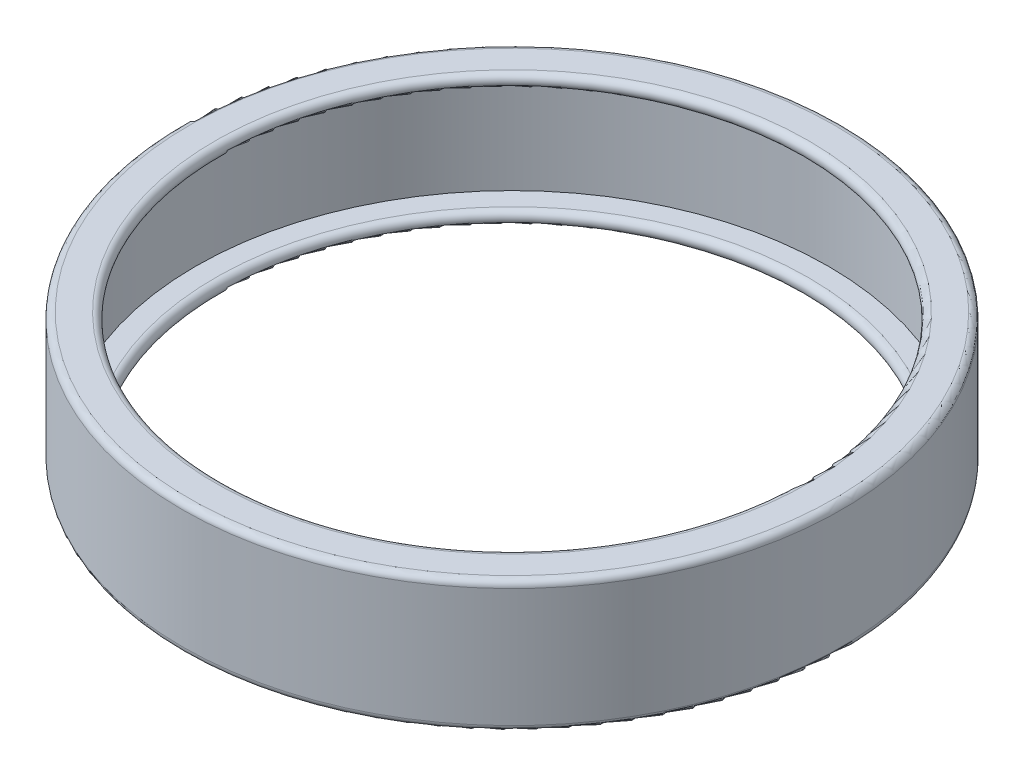
ISO-10303-21;
HEADER;
FILE_DESCRIPTION(('STEP AP214'),'2;1');
FILE_NAME('part.step','',(''),(''),'','','');
FILE_SCHEMA(('AUTOMOTIVE_DESIGN { 1 0 10303 214 1 1 1 1 }'));
ENDSEC;
DATA;
#1=APPLICATION_CONTEXT('core data for automotive mechanical design processes');
#2=APPLICATION_PROTOCOL_DEFINITION('international standard','automotive_design',2000,#1);
#3=PRODUCT_CONTEXT('',#1,'mechanical');
#4=PRODUCT('Part','Part','',(#3));
#5=PRODUCT_RELATED_PRODUCT_CATEGORY('part','',(#4));
#6=PRODUCT_DEFINITION_FORMATION('','',#4);
#7=PRODUCT_DEFINITION_CONTEXT('part definition',#1,'design');
#8=PRODUCT_DEFINITION('design','',#6,#7);
#9=PRODUCT_DEFINITION_SHAPE('','',#8);
#10=(LENGTH_UNIT() NAMED_UNIT(*) SI_UNIT(.MILLI.,.METRE.));
#11=(NAMED_UNIT(*) PLANE_ANGLE_UNIT() SI_UNIT($,.RADIAN.));
#12=(NAMED_UNIT(*) SI_UNIT($,.STERADIAN.) SOLID_ANGLE_UNIT());
#13=UNCERTAINTY_MEASURE_WITH_UNIT(LENGTH_MEASURE(1.E-05),#10,'distance_accuracy_value','');
#14=(GEOMETRIC_REPRESENTATION_CONTEXT(3) GLOBAL_UNCERTAINTY_ASSIGNED_CONTEXT((#13)) GLOBAL_UNIT_ASSIGNED_CONTEXT((#10,
#11,#12)) REPRESENTATION_CONTEXT('',''));
#15=CARTESIAN_POINT('',(0.,0.,0.));
#16=DIRECTION('',(0.,0.,1.));
#17=DIRECTION('',(1.,0.,0.));
#18=AXIS2_PLACEMENT_3D('',#15,#16,#17);
#19=CARTESIAN_POINT('',(0.,-4.5,0.));
#20=DIRECTION('',(0.,-1.,0.));
#21=DIRECTION('',(0.,0.,-1.));
#22=AXIS2_PLACEMENT_3D('',#19,#20,#21);
#23=TOROIDAL_SURFACE('',#22,22.5,0.5);
#24=CARTESIAN_POINT('',(0.,-5.,0.));
#25=DIRECTION('',(0.,1.,0.));
#26=DIRECTION('',(0.,0.,1.));
#27=AXIS2_PLACEMENT_3D('',#24,#25,#26);
#28=CIRCLE('',#27,22.5);
#29=CARTESIAN_POINT('',(0.,-5.,22.5));
#30=VERTEX_POINT('',#29);
#31=EDGE_CURVE('E48',#30,#30,#28,.T.);
#32=ORIENTED_EDGE('',*,*,#31,.F.);
#33=EDGE_LOOP('',(#32));
#34=FACE_BOUND('',#33,.T.);
#35=CARTESIAN_POINT('',(0.,-4.,0.));
#36=DIRECTION('',(0.,-1.,0.));
#37=DIRECTION('',(0.,0.,-1.));
#38=AXIS2_PLACEMENT_3D('',#35,#36,#37);
#39=CIRCLE('',#38,22.5);
#40=CARTESIAN_POINT('',(0.,-4.,-22.5));
#41=VERTEX_POINT('',#40);
#42=EDGE_CURVE('E10',#41,#41,#39,.T.);
#43=ORIENTED_EDGE('',*,*,#42,.F.);
#44=EDGE_LOOP('',(#43));
#45=FACE_BOUND('',#44,.T.);
#46=ADVANCED_FACE('F41',(#34,#45),#23,.T.);
#47=CARTESIAN_POINT('',(0.,4.5,0.));
#48=DIRECTION('',(0.,-1.,0.));
#49=DIRECTION('',(0.,0.,-1.));
#50=AXIS2_PLACEMENT_3D('',#47,#48,#49);
#51=TOROIDAL_SURFACE('',#50,22.5,0.5);
#52=CARTESIAN_POINT('',(0.,5.,0.));
#53=DIRECTION('',(0.,-1.,0.));
#54=DIRECTION('',(0.,0.,-1.));
#55=AXIS2_PLACEMENT_3D('',#52,#53,#54);
#56=CIRCLE('',#55,22.5);
#57=CARTESIAN_POINT('',(0.,5.,-22.5));
#58=VERTEX_POINT('',#57);
#59=EDGE_CURVE('E57',#58,#58,#56,.T.);
#60=ORIENTED_EDGE('',*,*,#59,.F.);
#61=EDGE_LOOP('',(#60));
#62=FACE_BOUND('',#61,.T.);
#63=CARTESIAN_POINT('',(0.,4.,0.));
#64=DIRECTION('',(0.,1.,0.));
#65=DIRECTION('',(0.,0.,1.));
#66=AXIS2_PLACEMENT_3D('',#63,#64,#65);
#67=CIRCLE('',#66,22.5);
#68=CARTESIAN_POINT('',(0.,4.,22.5));
#69=VERTEX_POINT('',#68);
#70=EDGE_CURVE('E55',#69,#69,#67,.T.);
#71=ORIENTED_EDGE('',*,*,#70,.F.);
#72=EDGE_LOOP('',(#71));
#73=FACE_BOUND('',#72,.T.);
#74=ADVANCED_FACE('F98',(#62,#73),#51,.T.);
#75=CARTESIAN_POINT('',(0.,-5.,22.));
#76=DIRECTION('',(0.,1.,0.));
#77=DIRECTION('',(0.,0.,1.));
#78=AXIS2_PLACEMENT_3D('',#75,#76,#77);
#79=PLANE('',#78);
#80=ORIENTED_EDGE('',*,*,#31,.T.);
#81=EDGE_LOOP('',(#80));
#82=FACE_BOUND('',#81,.T.);
#83=CARTESIAN_POINT('',(0.,-5.,0.));
#84=DIRECTION('',(0.,1.,0.));
#85=DIRECTION('',(0.,0.,1.));
#86=AXIS2_PLACEMENT_3D('',#83,#84,#85);
#87=CIRCLE('',#86,24.5);
#88=CARTESIAN_POINT('',(0.,-5.,24.5));
#89=VERTEX_POINT('',#88);
#90=EDGE_CURVE('E69',#89,#89,#87,.F.);
#91=ORIENTED_EDGE('',*,*,#90,.T.);
#92=EDGE_LOOP('',(#91));
#93=FACE_BOUND('',#92,.T.);
#94=ADVANCED_FACE('F102',(#82,#93),#79,.F.);
#95=CARTESIAN_POINT('',(0.,-15.4469304837593,0.));
#96=DIRECTION('',(0.,-1.,0.));
#97=DIRECTION('',(0.,0.,-1.));
#98=AXIS2_PLACEMENT_3D('',#95,#96,#97);
#99=CYLINDRICAL_SURFACE('',#98,25.);
#100=CARTESIAN_POINT('',(0.,-4.5,0.));
#101=DIRECTION('',(0.,1.,0.));
#102=DIRECTION('',(0.,0.,1.));
#103=AXIS2_PLACEMENT_3D('',#100,#101,#102);
#104=CIRCLE('',#103,25.);
#105=CARTESIAN_POINT('',(0.,-4.5,25.));
#106=VERTEX_POINT('',#105);
#107=EDGE_CURVE('E61',#106,#106,#104,.T.);
#108=ORIENTED_EDGE('',*,*,#107,.T.);
#109=EDGE_LOOP('',(#108));
#110=FACE_BOUND('',#109,.T.);
#111=CARTESIAN_POINT('',(0.,4.5,0.));
#112=DIRECTION('',(0.,-1.,0.));
#113=DIRECTION('',(0.,0.,-1.));
#114=AXIS2_PLACEMENT_3D('',#111,#112,#113);
#115=CIRCLE('',#114,25.);
#116=CARTESIAN_POINT('',(0.,4.5,-25.));
#117=VERTEX_POINT('',#116);
#118=EDGE_CURVE('E70',#117,#117,#115,.T.);
#119=ORIENTED_EDGE('',*,*,#118,.T.);
#120=EDGE_LOOP('',(#119));
#121=FACE_BOUND('',#120,.T.);
#122=ADVANCED_FACE('F112',(#110,#121),#99,.T.);
#123=CARTESIAN_POINT('',(0.,5.,25.));
#124=DIRECTION('',(0.,-1.,0.));
#125=DIRECTION('',(0.,0.,-1.));
#126=AXIS2_PLACEMENT_3D('',#123,#124,#125);
#127=PLANE('',#126);
#128=ORIENTED_EDGE('',*,*,#59,.T.);
#129=EDGE_LOOP('',(#128));
#130=FACE_BOUND('',#129,.T.);
#131=CARTESIAN_POINT('',(0.,5.,0.));
#132=DIRECTION('',(0.,-1.,0.));
#133=DIRECTION('',(0.,0.,-1.));
#134=AXIS2_PLACEMENT_3D('',#131,#132,#133);
#135=CIRCLE('',#134,24.5);
#136=CARTESIAN_POINT('',(0.,5.,-24.5));
#137=VERTEX_POINT('',#136);
#138=EDGE_CURVE('E62',#137,#137,#135,.F.);
#139=ORIENTED_EDGE('',*,*,#138,.T.);
#140=EDGE_LOOP('',(#139));
#141=FACE_BOUND('',#140,.T.);
#142=ADVANCED_FACE('F121',(#130,#141),#127,.F.);
#143=CARTESIAN_POINT('',(0.,4.,22.));
#144=DIRECTION('',(0.,1.,0.));
#145=DIRECTION('',(0.,0.,1.));
#146=AXIS2_PLACEMENT_3D('',#143,#144,#145);
#147=PLANE('',#146);
#148=ORIENTED_EDGE('',*,*,#70,.T.);
#149=EDGE_LOOP('',(#148));
#150=FACE_BOUND('',#149,.T.);
#151=CARTESIAN_POINT('',(0.,4.,0.));
#152=DIRECTION('',(0.,-1.,0.));
#153=DIRECTION('',(0.,0.,-1.));
#154=AXIS2_PLACEMENT_3D('',#151,#152,#153);
#155=CIRCLE('',#154,24.);
#156=CARTESIAN_POINT('',(0.,4.,-24.));
#157=VERTEX_POINT('',#156);
#158=EDGE_CURVE('E71',#157,#157,#155,.T.);
#159=ORIENTED_EDGE('',*,*,#158,.T.);
#160=EDGE_LOOP('',(#159));
#161=FACE_BOUND('',#160,.T.);
#162=ADVANCED_FACE('F94',(#150,#161),#147,.F.);
#163=CARTESIAN_POINT('',(0.,-15.4469304837593,0.));
#164=DIRECTION('',(0.,-1.,0.));
#165=DIRECTION('',(0.,0.,-1.));
#166=AXIS2_PLACEMENT_3D('',#163,#164,#165);
#167=CYLINDRICAL_SURFACE('',#166,24.);
#168=ORIENTED_EDGE('',*,*,#158,.F.);
#169=EDGE_LOOP('',(#168));
#170=FACE_BOUND('',#169,.T.);
#171=CARTESIAN_POINT('',(0.,-4.,0.));
#172=DIRECTION('',(0.,-1.,0.));
#173=DIRECTION('',(0.,0.,-1.));
#174=AXIS2_PLACEMENT_3D('',#171,#172,#173);
#175=CIRCLE('',#174,24.);
#176=CARTESIAN_POINT('',(0.,-4.,-24.));
#177=VERTEX_POINT('',#176);
#178=EDGE_CURVE('E77',#177,#177,#175,.T.);
#179=ORIENTED_EDGE('',*,*,#178,.T.);
#180=EDGE_LOOP('',(#179));
#181=FACE_BOUND('',#180,.T.);
#182=ADVANCED_FACE('F78',(#170,#181),#167,.F.);
#183=CARTESIAN_POINT('',(0.,-4.,24.));
#184=DIRECTION('',(0.,-1.,0.));
#185=DIRECTION('',(0.,0.,-1.));
#186=AXIS2_PLACEMENT_3D('',#183,#184,#185);
#187=PLANE('',#186);
#188=ORIENTED_EDGE('',*,*,#42,.T.);
#189=EDGE_LOOP('',(#188));
#190=FACE_BOUND('',#189,.T.);
#191=ORIENTED_EDGE('',*,*,#178,.F.);
#192=EDGE_LOOP('',(#191));
#193=FACE_BOUND('',#192,.T.);
#194=ADVANCED_FACE('F85',(#190,#193),#187,.F.);
#195=CARTESIAN_POINT('',(0.,-4.5,0.));
#196=DIRECTION('',(0.,1.,0.));
#197=DIRECTION('',(0.,0.,1.));
#198=AXIS2_PLACEMENT_3D('',#195,#196,#197);
#199=TOROIDAL_SURFACE('',#198,24.5,0.5);
#200=ORIENTED_EDGE('',*,*,#107,.F.);
#201=EDGE_LOOP('',(#200));
#202=FACE_BOUND('',#201,.T.);
#203=ORIENTED_EDGE('',*,*,#90,.F.);
#204=EDGE_LOOP('',(#203));
#205=FACE_BOUND('',#204,.T.);
#206=ADVANCED_FACE('F82',(#202,#205),#199,.T.);
#207=CARTESIAN_POINT('',(0.,4.5,0.));
#208=DIRECTION('',(0.,-1.,0.));
#209=DIRECTION('',(0.,0.,-1.));
#210=AXIS2_PLACEMENT_3D('',#207,#208,#209);
#211=TOROIDAL_SURFACE('',#210,24.5,0.5);
#212=ORIENTED_EDGE('',*,*,#138,.F.);
#213=EDGE_LOOP('',(#212));
#214=FACE_BOUND('',#213,.T.);
#215=ORIENTED_EDGE('',*,*,#118,.F.);
#216=EDGE_LOOP('',(#215));
#217=FACE_BOUND('',#216,.T.);
#218=ADVANCED_FACE('F89',(#214,#217),#211,.T.);
#219=CLOSED_SHELL('',(#46,#74,#94,#122,#142,#162,#182,#194,#206,#218));
#220=MANIFOLD_SOLID_BREP('B2',#219);
#221=ADVANCED_BREP_SHAPE_REPRESENTATION('',(#18,#220),#14);
#222=SHAPE_DEFINITION_REPRESENTATION(#9,#221);
ENDSEC;
END-ISO-10303-21;
